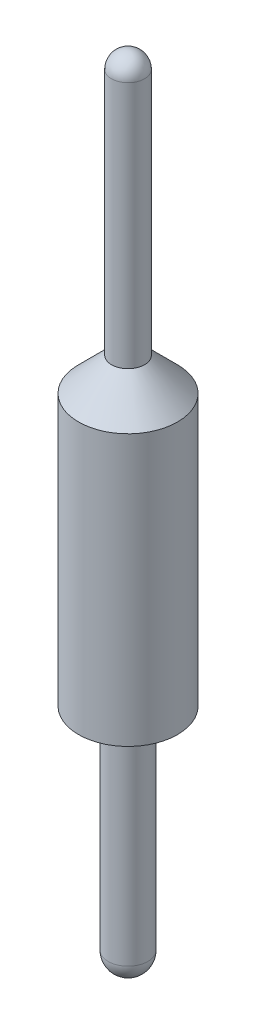
ISO-10303-21;
HEADER;
FILE_DESCRIPTION(('STEP AP214'),'2;1');
FILE_NAME('part.step','',(''),(''),'','','');
FILE_SCHEMA(('AUTOMOTIVE_DESIGN { 1 0 10303 214 1 1 1 1 }'));
ENDSEC;
DATA;
#1=APPLICATION_CONTEXT('core data for automotive mechanical design processes');
#2=APPLICATION_PROTOCOL_DEFINITION('international standard','automotive_design',2000,#1);
#3=PRODUCT_CONTEXT('',#1,'mechanical');
#4=PRODUCT('Part','Part','',(#3));
#5=PRODUCT_RELATED_PRODUCT_CATEGORY('part','',(#4));
#6=PRODUCT_DEFINITION_FORMATION('','',#4);
#7=PRODUCT_DEFINITION_CONTEXT('part definition',#1,'design');
#8=PRODUCT_DEFINITION('design','',#6,#7);
#9=PRODUCT_DEFINITION_SHAPE('','',#8);
#10=(LENGTH_UNIT() NAMED_UNIT(*) SI_UNIT(.MILLI.,.METRE.));
#11=(NAMED_UNIT(*) PLANE_ANGLE_UNIT() SI_UNIT($,.RADIAN.));
#12=(NAMED_UNIT(*) SI_UNIT($,.STERADIAN.) SOLID_ANGLE_UNIT());
#13=UNCERTAINTY_MEASURE_WITH_UNIT(LENGTH_MEASURE(1.E-05),#10,'distance_accuracy_value','');
#14=(GEOMETRIC_REPRESENTATION_CONTEXT(3) GLOBAL_UNCERTAINTY_ASSIGNED_CONTEXT((#13)) GLOBAL_UNIT_ASSIGNED_CONTEXT((#10,
#11,#12)) REPRESENTATION_CONTEXT('',''));
#15=CARTESIAN_POINT('',(0.,0.,0.));
#16=DIRECTION('',(0.,0.,1.));
#17=DIRECTION('',(1.,0.,0.));
#18=AXIS2_PLACEMENT_3D('',#15,#16,#17);
#19=CARTESIAN_POINT('',(-12.7,11.85,0.));
#20=DIRECTION('',(1.,0.,0.));
#21=DIRECTION('',(0.,1.,0.));
#22=AXIS2_PLACEMENT_3D('',#19,#20,#21);
#23=SPHERICAL_SURFACE('',#22,0.25);
#24=CARTESIAN_POINT('',(-12.7,11.85,0.));
#25=DIRECTION('',(0.,-1.,0.));
#26=DIRECTION('',(1.,0.,0.));
#27=AXIS2_PLACEMENT_3D('',#24,#25,#26);
#28=CIRCLE('',#27,0.25);
#29=CARTESIAN_POINT('',(-12.45,11.85,0.));
#30=VERTEX_POINT('',#29);
#31=CARTESIAN_POINT('',(-12.95,11.85,0.));
#32=VERTEX_POINT('',#31);
#33=EDGE_CURVE('E44',#30,#32,#28,.T.);
#34=ORIENTED_EDGE('',*,*,#33,.F.);
#35=CARTESIAN_POINT('',(-12.7,11.85,0.));
#36=DIRECTION('',(0.,-1.,0.));
#37=DIRECTION('',(1.,0.,0.));
#38=AXIS2_PLACEMENT_3D('',#35,#36,#37);
#39=CIRCLE('',#38,0.25);
#40=EDGE_CURVE('E42',#32,#30,#39,.T.);
#41=ORIENTED_EDGE('',*,*,#40,.F.);
#42=EDGE_LOOP('',(#34,#41));
#43=FACE_BOUND('',#42,.T.);
#44=ADVANCED_FACE('F17',(#43),#23,.T.);
#45=CARTESIAN_POINT('',(-12.7,0.3,0.));
#46=DIRECTION('',(-1.,0.,0.));
#47=DIRECTION('',(0.,1.,0.));
#48=AXIS2_PLACEMENT_3D('',#45,#46,#47);
#49=SPHERICAL_SURFACE('',#48,0.3);
#50=CARTESIAN_POINT('',(-12.7,0.3,0.));
#51=DIRECTION('',(0.,-1.,0.));
#52=DIRECTION('',(1.,0.,0.));
#53=AXIS2_PLACEMENT_3D('',#50,#51,#52);
#54=CIRCLE('',#53,0.300000000000002);
#55=CARTESIAN_POINT('',(-12.4,0.3,0.));
#56=VERTEX_POINT('',#55);
#57=CARTESIAN_POINT('',(-13.,0.3,0.));
#58=VERTEX_POINT('',#57);
#59=EDGE_CURVE('E46',#56,#58,#54,.F.);
#60=ORIENTED_EDGE('',*,*,#59,.F.);
#61=CARTESIAN_POINT('',(-12.7,0.3,0.));
#62=DIRECTION('',(0.,-1.,0.));
#63=DIRECTION('',(1.,0.,0.));
#64=AXIS2_PLACEMENT_3D('',#61,#62,#63);
#65=CIRCLE('',#64,0.300000000000002);
#66=EDGE_CURVE('E34',#58,#56,#65,.F.);
#67=ORIENTED_EDGE('',*,*,#66,.F.);
#68=EDGE_LOOP('',(#60,#67));
#69=FACE_BOUND('',#68,.T.);
#70=ADVANCED_FACE('F66',(#69),#49,.T.);
#71=CARTESIAN_POINT('',(-12.7,0.,0.));
#72=DIRECTION('',(0.,-1.,0.));
#73=DIRECTION('',(1.,0.,0.));
#74=AXIS2_PLACEMENT_3D('',#71,#72,#73);
#75=CYLINDRICAL_SURFACE('',#74,0.25);
#76=CARTESIAN_POINT('',(-12.7,8.09999999995625,0.));
#77=DIRECTION('',(0.,-1.,0.));
#78=DIRECTION('',(1.,0.,0.));
#79=AXIS2_PLACEMENT_3D('',#76,#77,#78);
#80=CIRCLE('',#79,0.250000000055662);
#81=CARTESIAN_POINT('',(-12.7,8.09999999995625,-0.250000000055665));
#82=VERTEX_POINT('',#81);
#83=EDGE_CURVE('E60',#82,#82,#80,.T.);
#84=ORIENTED_EDGE('',*,*,#83,.F.);
#85=EDGE_LOOP('',(#84));
#86=FACE_BOUND('',#85,.T.);
#87=ORIENTED_EDGE('',*,*,#33,.T.);
#88=ORIENTED_EDGE('',*,*,#40,.T.);
#89=EDGE_LOOP('',(#87,#88));
#90=FACE_BOUND('',#89,.T.);
#91=ADVANCED_FACE('F48',(#86,#90),#75,.T.);
#92=CARTESIAN_POINT('',(-12.7,0.,0.));
#93=DIRECTION('',(0.,-1.,0.));
#94=DIRECTION('',(1.,0.,0.));
#95=AXIS2_PLACEMENT_3D('',#92,#93,#94);
#96=CYLINDRICAL_SURFACE('',#95,0.300000000000002);
#97=CARTESIAN_POINT('',(-12.7,3.5,0.));
#98=DIRECTION('',(0.,-1.,0.));
#99=DIRECTION('',(1.,0.,0.));
#100=AXIS2_PLACEMENT_3D('',#97,#98,#99);
#101=CIRCLE('',#100,0.300000000000002);
#102=CARTESIAN_POINT('',(-12.4,3.5,0.));
#103=VERTEX_POINT('',#102);
#104=EDGE_CURVE('E21',#103,#103,#101,.F.);
#105=ORIENTED_EDGE('',*,*,#104,.F.);
#106=EDGE_LOOP('',(#105));
#107=FACE_BOUND('',#106,.T.);
#108=ORIENTED_EDGE('',*,*,#59,.T.);
#109=ORIENTED_EDGE('',*,*,#66,.T.);
#110=EDGE_LOOP('',(#108,#109));
#111=FACE_BOUND('',#110,.T.);
#112=ADVANCED_FACE('F72',(#107,#111),#96,.T.);
#113=CARTESIAN_POINT('',(-12.7,7.60000000013861,0.));
#114=DIRECTION('',(0.,-1.,0.));
#115=DIRECTION('',(0.,0.,-1.));
#116=AXIS2_PLACEMENT_3D('',#113,#114,#115);
#117=CONICAL_SURFACE('',#116,0.749999999873309,0.785398163397448);
#118=CARTESIAN_POINT('',(-12.7,7.6,0.));
#119=DIRECTION('',(0.,-1.,0.));
#120=DIRECTION('',(1.,0.,0.));
#121=AXIS2_PLACEMENT_3D('',#118,#119,#120);
#122=CIRCLE('',#121,0.750000000000001);
#123=CARTESIAN_POINT('',(-12.7,7.6,-0.750000000011921));
#124=VERTEX_POINT('',#123);
#125=EDGE_CURVE('E27',#124,#124,#122,.T.);
#126=CARTESIAN_POINT('',(-12.7,7.6,-0.750000000011921));
#127=CARTESIAN_POINT('',(-12.7,7.60520833333288,-0.744791666679043));
#128=CARTESIAN_POINT('',(-12.7,7.61041666666575,-0.739583333346165));
#129=CARTESIAN_POINT('',(-12.7,7.62083333333151,-0.72916666668041));
#130=CARTESIAN_POINT('',(-12.7,7.62604166666439,-0.723958333347532));
#131=CARTESIAN_POINT('',(-12.7,7.63645833333014,-0.713541666681777));
#132=CARTESIAN_POINT('',(-12.7,7.64166666666302,-0.708333333348899));
#133=CARTESIAN_POINT('',(-12.7,7.65208333332877,-0.697916666683144));
#134=CARTESIAN_POINT('',(-12.7,7.65729166666165,-0.692708333350266));
#135=CARTESIAN_POINT('',(-12.7,7.66770833332741,-0.682291666684511));
#136=CARTESIAN_POINT('',(-12.7,7.67291666666029,-0.677083333351633));
#137=CARTESIAN_POINT('',(-12.7,7.68333333332604,-0.666666666685878));
#138=CARTESIAN_POINT('',(-12.7,7.68854166665892,-0.661458333353));
#139=CARTESIAN_POINT('',(-12.7,7.69895833332467,-0.651041666687245));
#140=CARTESIAN_POINT('',(-12.7,7.70416666665755,-0.645833333354367));
#141=CARTESIAN_POINT('',(-12.7,7.71458333332331,-0.635416666688612));
#142=CARTESIAN_POINT('',(-12.7,7.71979166665619,-0.630208333355734));
#143=CARTESIAN_POINT('',(-12.7,7.73020833332194,-0.619791666689979));
#144=CARTESIAN_POINT('',(-12.7,7.73541666665482,-0.614583333357101));
#145=CARTESIAN_POINT('',(-12.7,7.74583333332057,-0.604166666691346));
#146=CARTESIAN_POINT('',(-12.7,7.75104166665345,-0.598958333358468));
#147=CARTESIAN_POINT('',(-12.7,7.76145833331921,-0.588541666692713));
#148=CARTESIAN_POINT('',(-12.7,7.76666666665208,-0.583333333359835));
#149=CARTESIAN_POINT('',(-12.7,7.77708333331784,-0.57291666669408));
#150=CARTESIAN_POINT('',(-12.7,7.78229166665072,-0.567708333361202));
#151=CARTESIAN_POINT('',(-12.7,7.79270833331647,-0.557291666695447));
#152=CARTESIAN_POINT('',(-12.7,7.79791666664935,-0.552083333362569));
#153=CARTESIAN_POINT('',(-12.7,7.8083333333151,-0.541666666696814));
#154=CARTESIAN_POINT('',(-12.7,7.81354166664798,-0.536458333363936));
#155=CARTESIAN_POINT('',(-12.7,7.82395833331374,-0.526041666698181));
#156=CARTESIAN_POINT('',(-12.7,7.82916666664662,-0.520833333365303));
#157=CARTESIAN_POINT('',(-12.7,7.83958333331237,-0.510416666699548));
#158=CARTESIAN_POINT('',(-12.7,7.84479166664525,-0.50520833336667));
#159=CARTESIAN_POINT('',(-12.7,7.855208333311,-0.494791666700915));
#160=CARTESIAN_POINT('',(-12.7,7.86041666664388,-0.489583333368037));
#161=CARTESIAN_POINT('',(-12.7,7.87083333330964,-0.479166666702282));
#162=CARTESIAN_POINT('',(-12.7,7.87604166664251,-0.473958333369404));
#163=CARTESIAN_POINT('',(-12.7,7.88645833330827,-0.463541666703649));
#164=CARTESIAN_POINT('',(-12.7,7.89166666664115,-0.458333333370771));
#165=CARTESIAN_POINT('',(-12.7,7.9020833333069,-0.447916666705016));
#166=CARTESIAN_POINT('',(-12.7,7.90729166663978,-0.442708333372138));
#167=CARTESIAN_POINT('',(-12.7,7.91770833330554,-0.432291666706383));
#168=CARTESIAN_POINT('',(-12.7,7.92291666663841,-0.427083333373505));
#169=CARTESIAN_POINT('',(-12.7,7.93333333330417,-0.41666666670775));
#170=CARTESIAN_POINT('',(-12.7,7.93854166663705,-0.411458333374872));
#171=CARTESIAN_POINT('',(-12.7,7.9489583333028,-0.401041666709117));
#172=CARTESIAN_POINT('',(-12.7,7.95416666663568,-0.395833333376239));
#173=CARTESIAN_POINT('',(-12.7,7.96458333330144,-0.385416666710484));
#174=CARTESIAN_POINT('',(-12.7,7.96979166663431,-0.380208333377606));
#175=CARTESIAN_POINT('',(-12.7,7.98020833330007,-0.369791666711851));
#176=CARTESIAN_POINT('',(-12.7,7.98541666663295,-0.364583333378973));
#177=CARTESIAN_POINT('',(-12.7,7.9958333332987,-0.354166666713218));
#178=CARTESIAN_POINT('',(-12.7,8.00104166663158,-0.34895833338034));
#179=CARTESIAN_POINT('',(-12.7,8.01145833329734,-0.338541666714585));
#180=CARTESIAN_POINT('',(-12.7,8.01666666663021,-0.333333333381708));
#181=CARTESIAN_POINT('',(-12.7,8.02708333329597,-0.322916666715952));
#182=CARTESIAN_POINT('',(-12.7,8.03229166662885,-0.317708333383074));
#183=CARTESIAN_POINT('',(-12.7,8.0427083332946,-0.307291666717319));
#184=CARTESIAN_POINT('',(-12.7,8.04791666662748,-0.302083333384441));
#185=CARTESIAN_POINT('',(-12.7,8.05833333329323,-0.291666666718686));
#186=CARTESIAN_POINT('',(-12.7,8.06354166662611,-0.286458333385808));
#187=CARTESIAN_POINT('',(-12.7,8.07395833329187,-0.276041666720053));
#188=CARTESIAN_POINT('',(-12.7,8.07916666662474,-0.270833333387176));
#189=CARTESIAN_POINT('',(-12.7,8.0895833332905,-0.26041666672142));
#190=CARTESIAN_POINT('',(-12.7,8.09479166662338,-0.255208333388543));
#191=CARTESIAN_POINT('',(-12.7,8.09999999995625,-0.250000000055665));
#192=B_SPLINE_CURVE_WITH_KNOTS('',3,(#126,#127,#128,#129,#130,#131,#132,#133,#134,#135,#136,
#137,#138,#139,#140,#141,#142,#143,#144,#145,#146,#147,#148,#149,#150,#151,#152,#153,#154,#155,
#156,#157,#158,#159,#160,#161,#162,#163,#164,#165,#166,#167,#168,#169,#170,#171,#172,#173,#174,
#175,#176,#177,#178,#179,#180,#181,#182,#183,#184,#185,#186,#187,#188,#189,#190,#191),
.UNSPECIFIED.,.F.,.F.,(4,2,2,2,2,2,2,2,2,2,2,2,2,2,2,2,2,2,2,2,2,2,2,2,2,2,2,2,2,2,2,2,4),(0.,
0.0220970869101451,0.0441941738202916,0.066291260730438,0.0883883476405844,0.110485434550731,
0.132582521460877,0.154679608371024,0.17677669528117,0.198873782191316,0.220970869101463,
0.243067956011609,0.265165042921756,0.287262129831902,0.309359216742048,0.331456303652194,
0.353553390562341,0.375650477472487,0.397747564382634,0.41984465129278,0.441941738202926,
0.464038825113073,0.486135912023219,0.508232998933366,0.530330085843512,0.552427172753658,
0.574524259663805,0.596621346573951,0.618718433484098,0.640815520394244,0.66291260730439,
0.685009694214537,0.707106781124682),.UNSPECIFIED.);
#193=EDGE_CURVE('BSEAM76',#124,#82,#192,.T.);
#194=ORIENTED_EDGE('',*,*,#125,.F.);
#195=ORIENTED_EDGE('',*,*,#83,.T.);
#196=ORIENTED_EDGE('',*,*,#193,.T.);
#197=ORIENTED_EDGE('',*,*,#193,.F.);
#198=EDGE_LOOP('',(#194,#196,#195,#197));
#199=FACE_BOUND('',#198,.T.);
#200=ADVANCED_FACE('F76',(#199),#117,.T.);
#201=CARTESIAN_POINT('',(-12.7,3.5,0.));
#202=DIRECTION('',(0.,-1.,0.));
#203=DIRECTION('',(1.,0.,0.));
#204=AXIS2_PLACEMENT_3D('',#201,#202,#203);
#205=PLANE('',#204);
#206=ORIENTED_EDGE('',*,*,#104,.T.);
#207=EDGE_LOOP('',(#206));
#208=FACE_BOUND('',#207,.T.);
#209=CARTESIAN_POINT('',(-12.7,3.5,0.));
#210=DIRECTION('',(0.,-1.,0.));
#211=DIRECTION('',(1.,0.,0.));
#212=AXIS2_PLACEMENT_3D('',#209,#210,#211);
#213=CIRCLE('',#212,0.750000000000001);
#214=CARTESIAN_POINT('',(-11.95,3.5,0.));
#215=VERTEX_POINT('',#214);
#216=EDGE_CURVE('E11',#215,#215,#213,.F.);
#217=ORIENTED_EDGE('',*,*,#216,.F.);
#218=EDGE_LOOP('',(#217));
#219=FACE_BOUND('',#218,.T.);
#220=ADVANCED_FACE('F80',(#208,#219),#205,.T.);
#221=CARTESIAN_POINT('',(-12.7,0.,0.));
#222=DIRECTION('',(0.,-1.,0.));
#223=DIRECTION('',(1.,0.,0.));
#224=AXIS2_PLACEMENT_3D('',#221,#222,#223);
#225=CYLINDRICAL_SURFACE('',#224,0.750000000000001);
#226=ORIENTED_EDGE('',*,*,#216,.T.);
#227=EDGE_LOOP('',(#226));
#228=FACE_BOUND('',#227,.T.);
#229=ORIENTED_EDGE('',*,*,#125,.T.);
#230=EDGE_LOOP('',(#229));
#231=FACE_BOUND('',#230,.T.);
#232=ADVANCED_FACE('F84',(#228,#231),#225,.T.);
#233=CLOSED_SHELL('',(#44,#70,#91,#112,#200,#220,#232));
#234=MANIFOLD_SOLID_BREP('B1',#233);
#235=ADVANCED_BREP_SHAPE_REPRESENTATION('',(#18,#234),#14);
#236=SHAPE_DEFINITION_REPRESENTATION(#9,#235);
ENDSEC;
END-ISO-10303-21;
